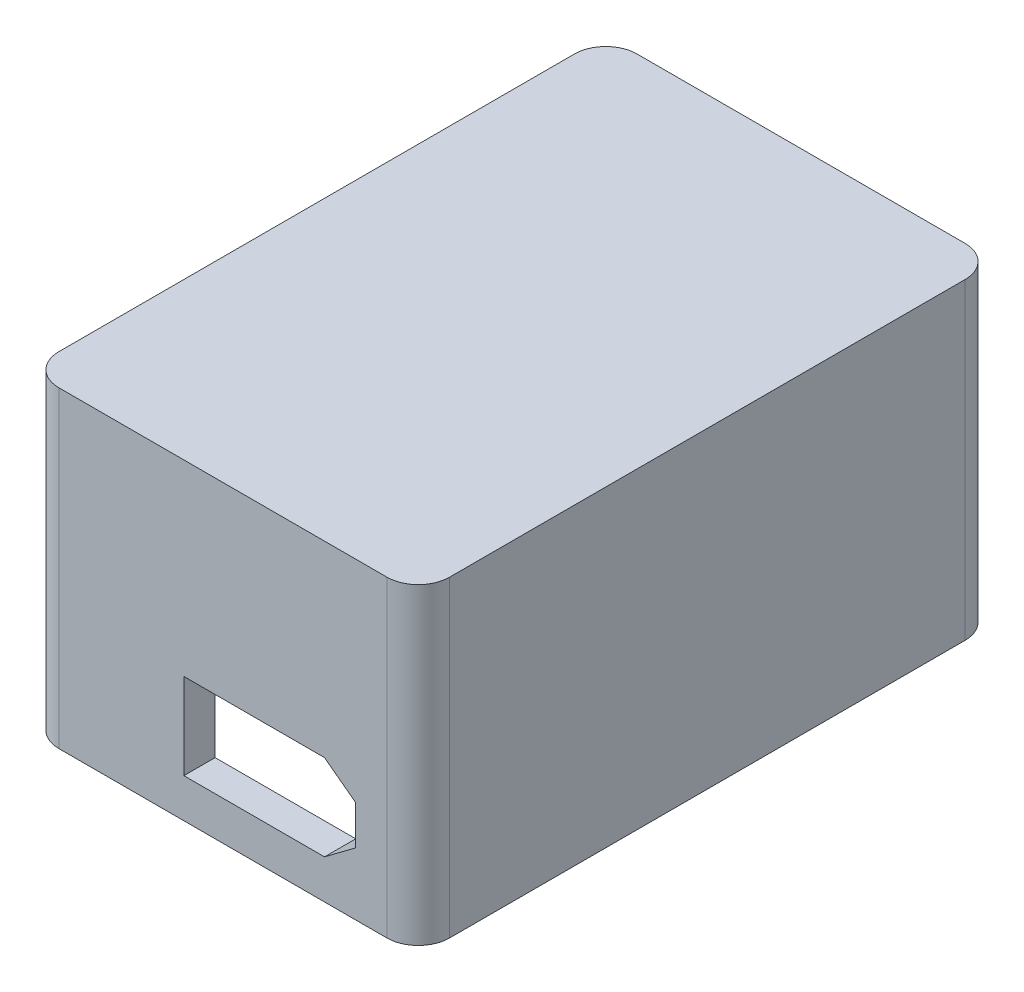
ISO-10303-21;
HEADER;
FILE_DESCRIPTION(('STEP AP214'),'2;1');
FILE_NAME('part.step','',(''),(''),'','','');
FILE_SCHEMA(('AUTOMOTIVE_DESIGN { 1 0 10303 214 1 1 1 1 }'));
ENDSEC;
DATA;
#1=APPLICATION_CONTEXT('core data for automotive mechanical design processes');
#2=APPLICATION_PROTOCOL_DEFINITION('international standard','automotive_design',2000,#1);
#3=PRODUCT_CONTEXT('',#1,'mechanical');
#4=PRODUCT('Part','Part','',(#3));
#5=PRODUCT_RELATED_PRODUCT_CATEGORY('part','',(#4));
#6=PRODUCT_DEFINITION_FORMATION('','',#4);
#7=PRODUCT_DEFINITION_CONTEXT('part definition',#1,'design');
#8=PRODUCT_DEFINITION('design','',#6,#7);
#9=PRODUCT_DEFINITION_SHAPE('','',#8);
#10=(LENGTH_UNIT() NAMED_UNIT(*) SI_UNIT(.MILLI.,.METRE.));
#11=(NAMED_UNIT(*) PLANE_ANGLE_UNIT() SI_UNIT($,.RADIAN.));
#12=(NAMED_UNIT(*) SI_UNIT($,.STERADIAN.) SOLID_ANGLE_UNIT());
#13=UNCERTAINTY_MEASURE_WITH_UNIT(LENGTH_MEASURE(1.E-05),#10,'distance_accuracy_value','');
#14=(GEOMETRIC_REPRESENTATION_CONTEXT(3) GLOBAL_UNCERTAINTY_ASSIGNED_CONTEXT((#13)) GLOBAL_UNIT_ASSIGNED_CONTEXT((#10,
#11,#12)) REPRESENTATION_CONTEXT('',''));
#15=CARTESIAN_POINT('',(0.,0.,0.));
#16=DIRECTION('',(0.,0.,1.));
#17=DIRECTION('',(1.,0.,0.));
#18=AXIS2_PLACEMENT_3D('',#15,#16,#17);
#19=CARTESIAN_POINT('',(12.5,20.,-18.5));
#20=DIRECTION('',(-1.,0.,0.));
#21=DIRECTION('',(0.,0.,1.));
#22=AXIS2_PLACEMENT_3D('',#19,#20,#21);
#23=PLANE('',#22);
#24=DIRECTION('',(0.,0.,-1.));
#25=VECTOR('',#24,1.);
#26=CARTESIAN_POINT('',(12.5,20.,-18.5));
#27=LINE('',#26,#25);
#28=CARTESIAN_POINT('',(12.5,20.,16.5));
#29=VERTEX_POINT('',#28);
#30=CARTESIAN_POINT('',(12.5,20.,-16.5));
#31=VERTEX_POINT('',#30);
#32=EDGE_CURVE('E299',#29,#31,#27,.T.);
#33=ORIENTED_EDGE('',*,*,#32,.F.);
#34=DIRECTION('',(0.,-1.,0.));
#35=VECTOR('',#34,1.);
#36=CARTESIAN_POINT('',(12.5,20.,16.5));
#37=LINE('',#36,#35);
#38=CARTESIAN_POINT('',(12.5,0.,16.5));
#39=VERTEX_POINT('',#38);
#40=EDGE_CURVE('E350',#29,#39,#37,.T.);
#41=ORIENTED_EDGE('',*,*,#40,.T.);
#42=DIRECTION('',(0.,0.,-1.));
#43=VECTOR('',#42,1.);
#44=CARTESIAN_POINT('',(12.5,0.,-18.5));
#45=LINE('',#44,#43);
#46=CARTESIAN_POINT('',(12.5,0.,-16.5));
#47=VERTEX_POINT('',#46);
#48=EDGE_CURVE('E271',#39,#47,#45,.T.);
#49=ORIENTED_EDGE('',*,*,#48,.T.);
#50=DIRECTION('',(0.,-1.,0.));
#51=VECTOR('',#50,1.);
#52=CARTESIAN_POINT('',(12.5,20.,-16.5));
#53=LINE('',#52,#51);
#54=EDGE_CURVE('E348',#47,#31,#53,.F.);
#55=ORIENTED_EDGE('',*,*,#54,.T.);
#56=EDGE_LOOP('',(#33,#41,#49,#55));
#57=FACE_BOUND('',#56,.T.);
#58=ADVANCED_FACE('F35',(#57),#23,.F.);
#59=CARTESIAN_POINT('',(-12.5,20.,-18.5));
#60=DIRECTION('',(0.,0.,1.));
#61=DIRECTION('',(1.,0.,0.));
#62=AXIS2_PLACEMENT_3D('',#59,#60,#61);
#63=PLANE('',#62);
#64=DIRECTION('',(-1.,0.,0.));
#65=VECTOR('',#64,1.);
#66=CARTESIAN_POINT('',(0.,9.8,-18.5));
#67=LINE('',#66,#65);
#68=CARTESIAN_POINT('',(3.5,9.8,-18.5));
#69=VERTEX_POINT('',#68);
#70=CARTESIAN_POINT('',(-3.5,9.8,-18.5));
#71=VERTEX_POINT('',#70);
#72=EDGE_CURVE('E185',#69,#71,#67,.T.);
#73=ORIENTED_EDGE('',*,*,#72,.F.);
#74=CARTESIAN_POINT('',(3.5,11.4,-18.5));
#75=DIRECTION('',(0.,0.,-1.));
#76=DIRECTION('',(-1.,0.,0.));
#77=AXIS2_PLACEMENT_3D('',#74,#75,#76);
#78=CIRCLE('',#77,1.6);
#79=CARTESIAN_POINT('',(3.5,13.,-18.5));
#80=VERTEX_POINT('',#79);
#81=EDGE_CURVE('E206',#80,#69,#78,.T.);
#82=ORIENTED_EDGE('',*,*,#81,.F.);
#83=DIRECTION('',(-1.,0.,0.));
#84=VECTOR('',#83,1.);
#85=CARTESIAN_POINT('',(0.,13.,-18.5));
#86=LINE('',#85,#84);
#87=CARTESIAN_POINT('',(-3.5,13.,-18.5));
#88=VERTEX_POINT('',#87);
#89=EDGE_CURVE('E50',#80,#88,#86,.T.);
#90=ORIENTED_EDGE('',*,*,#89,.T.);
#91=CARTESIAN_POINT('',(-3.5,11.4,-18.5));
#92=DIRECTION('',(0.,0.,-1.));
#93=DIRECTION('',(-1.,0.,0.));
#94=AXIS2_PLACEMENT_3D('',#91,#92,#93);
#95=CIRCLE('',#94,1.6);
#96=EDGE_CURVE('E193',#71,#88,#95,.T.);
#97=ORIENTED_EDGE('',*,*,#96,.F.);
#98=EDGE_LOOP('',(#73,#82,#90,#97));
#99=FACE_BOUND('',#98,.T.);
#100=DIRECTION('',(-1.,0.,0.));
#101=VECTOR('',#100,1.);
#102=CARTESIAN_POINT('',(-12.5,0.,-18.5));
#103=LINE('',#102,#101);
#104=CARTESIAN_POINT('',(10.5,0.,-18.5));
#105=VERTEX_POINT('',#104);
#106=CARTESIAN_POINT('',(-10.5,0.,-18.5));
#107=VERTEX_POINT('',#106);
#108=EDGE_CURVE('E315',#105,#107,#103,.T.);
#109=ORIENTED_EDGE('',*,*,#108,.T.);
#110=DIRECTION('',(0.,-1.,0.));
#111=VECTOR('',#110,1.);
#112=CARTESIAN_POINT('',(-10.5,20.,-18.5));
#113=LINE('',#112,#111);
#114=CARTESIAN_POINT('',(-10.5,20.,-18.5));
#115=VERTEX_POINT('',#114);
#116=EDGE_CURVE('E11',#107,#115,#113,.F.);
#117=ORIENTED_EDGE('',*,*,#116,.T.);
#118=DIRECTION('',(-1.,0.,0.));
#119=VECTOR('',#118,1.);
#120=CARTESIAN_POINT('',(-12.5,20.,-18.5));
#121=LINE('',#120,#119);
#122=CARTESIAN_POINT('',(10.5,20.,-18.5));
#123=VERTEX_POINT('',#122);
#124=EDGE_CURVE('E302',#123,#115,#121,.T.);
#125=ORIENTED_EDGE('',*,*,#124,.F.);
#126=DIRECTION('',(0.,-1.,0.));
#127=VECTOR('',#126,1.);
#128=CARTESIAN_POINT('',(10.5,20.,-18.5));
#129=LINE('',#128,#127);
#130=EDGE_CURVE('E43',#123,#105,#129,.T.);
#131=ORIENTED_EDGE('',*,*,#130,.T.);
#132=EDGE_LOOP('',(#109,#117,#125,#131));
#133=FACE_BOUND('',#132,.T.);
#134=ADVANCED_FACE('F203',(#99,#133),#63,.F.);
#135=CARTESIAN_POINT('',(-12.5,20.,-18.5));
#136=DIRECTION('',(1.,0.,0.));
#137=DIRECTION('',(0.,0.,-1.));
#138=AXIS2_PLACEMENT_3D('',#135,#136,#137);
#139=PLANE('',#138);
#140=DIRECTION('',(0.,0.,1.));
#141=VECTOR('',#140,1.);
#142=CARTESIAN_POINT('',(-12.5,0.,-18.5));
#143=LINE('',#142,#141);
#144=CARTESIAN_POINT('',(-12.5,0.,-16.5));
#145=VERTEX_POINT('',#144);
#146=CARTESIAN_POINT('',(-12.5,0.,16.5));
#147=VERTEX_POINT('',#146);
#148=EDGE_CURVE('E318',#145,#147,#143,.T.);
#149=ORIENTED_EDGE('',*,*,#148,.T.);
#150=DIRECTION('',(0.,-1.,0.));
#151=VECTOR('',#150,1.);
#152=CARTESIAN_POINT('',(-12.5,20.,16.5));
#153=LINE('',#152,#151);
#154=CARTESIAN_POINT('',(-12.5,20.,16.5));
#155=VERTEX_POINT('',#154);
#156=EDGE_CURVE('E338',#147,#155,#153,.F.);
#157=ORIENTED_EDGE('',*,*,#156,.T.);
#158=DIRECTION('',(0.,0.,1.));
#159=VECTOR('',#158,1.);
#160=CARTESIAN_POINT('',(-12.5,20.,-18.5));
#161=LINE('',#160,#159);
#162=CARTESIAN_POINT('',(-12.5,20.,-16.5));
#163=VERTEX_POINT('',#162);
#164=EDGE_CURVE('E306',#163,#155,#161,.T.);
#165=ORIENTED_EDGE('',*,*,#164,.F.);
#166=DIRECTION('',(0.,-1.,0.));
#167=VECTOR('',#166,1.);
#168=CARTESIAN_POINT('',(-12.5,20.,-16.5));
#169=LINE('',#168,#167);
#170=EDGE_CURVE('E335',#163,#145,#169,.T.);
#171=ORIENTED_EDGE('',*,*,#170,.T.);
#172=EDGE_LOOP('',(#149,#157,#165,#171));
#173=FACE_BOUND('',#172,.T.);
#174=ADVANCED_FACE('F370',(#173),#139,.F.);
#175=CARTESIAN_POINT('',(-12.5,20.,18.5));
#176=DIRECTION('',(0.,0.,-1.));
#177=DIRECTION('',(-1.,0.,0.));
#178=AXIS2_PLACEMENT_3D('',#175,#176,#177);
#179=PLANE('',#178);
#180=DIRECTION('',(0.8,-0.6,0.));
#181=VECTOR('',#180,1.);
#182=CARTESIAN_POINT('',(6.18,8.24,18.5));
#183=LINE('',#182,#181);
#184=CARTESIAN_POINT('',(6.5,8.,18.5));
#185=VERTEX_POINT('',#184);
#186=CARTESIAN_POINT('',(8.5,6.5,18.5));
#187=VERTEX_POINT('',#186);
#188=EDGE_CURVE('E236',#185,#187,#183,.T.);
#189=ORIENTED_EDGE('',*,*,#188,.T.);
#190=DIRECTION('',(0.,-1.,0.));
#191=VECTOR('',#190,1.);
#192=CARTESIAN_POINT('',(8.5,0.,18.5));
#193=LINE('',#192,#191);
#194=CARTESIAN_POINT('',(8.5,4.,18.5));
#195=VERTEX_POINT('',#194);
#196=EDGE_CURVE('E222',#187,#195,#193,.T.);
#197=ORIENTED_EDGE('',*,*,#196,.T.);
#198=DIRECTION('',(-0.8,-0.6,0.));
#199=VECTOR('',#198,1.);
#200=CARTESIAN_POINT('',(1.14,-1.52,18.5));
#201=LINE('',#200,#199);
#202=CARTESIAN_POINT('',(6.5,2.5,18.5));
#203=VERTEX_POINT('',#202);
#204=EDGE_CURVE('E225',#195,#203,#201,.T.);
#205=ORIENTED_EDGE('',*,*,#204,.T.);
#206=DIRECTION('',(-1.,0.,0.));
#207=VECTOR('',#206,1.);
#208=CARTESIAN_POINT('',(0.,2.5,18.5));
#209=LINE('',#208,#207);
#210=CARTESIAN_POINT('',(-2.5,2.5,18.5));
#211=VERTEX_POINT('',#210);
#212=EDGE_CURVE('E229',#203,#211,#209,.T.);
#213=ORIENTED_EDGE('',*,*,#212,.T.);
#214=DIRECTION('',(0.,-1.,0.));
#215=VECTOR('',#214,1.);
#216=CARTESIAN_POINT('',(-2.5,0.,18.5));
#217=LINE('',#216,#215);
#218=CARTESIAN_POINT('',(-2.5,8.,18.5));
#219=VERTEX_POINT('',#218);
#220=EDGE_CURVE('E232',#219,#211,#217,.T.);
#221=ORIENTED_EDGE('',*,*,#220,.F.);
#222=DIRECTION('',(-1.,0.,0.));
#223=VECTOR('',#222,1.);
#224=CARTESIAN_POINT('',(0.,8.,18.5));
#225=LINE('',#224,#223);
#226=EDGE_CURVE('E234',#185,#219,#225,.T.);
#227=ORIENTED_EDGE('',*,*,#226,.F.);
#228=EDGE_LOOP('',(#189,#197,#205,#213,#221,#227));
#229=FACE_BOUND('',#228,.T.);
#230=DIRECTION('',(1.,0.,0.));
#231=VECTOR('',#230,1.);
#232=CARTESIAN_POINT('',(-12.5,20.,18.5));
#233=LINE('',#232,#231);
#234=CARTESIAN_POINT('',(-10.5,20.,18.5));
#235=VERTEX_POINT('',#234);
#236=CARTESIAN_POINT('',(10.5,20.,18.5));
#237=VERTEX_POINT('',#236);
#238=EDGE_CURVE('E309',#235,#237,#233,.T.);
#239=ORIENTED_EDGE('',*,*,#238,.F.);
#240=DIRECTION('',(0.,-1.,0.));
#241=VECTOR('',#240,1.);
#242=CARTESIAN_POINT('',(-10.5,20.,18.5));
#243=LINE('',#242,#241);
#244=CARTESIAN_POINT('',(-10.5,0.,18.5));
#245=VERTEX_POINT('',#244);
#246=EDGE_CURVE('E324',#235,#245,#243,.T.);
#247=ORIENTED_EDGE('',*,*,#246,.T.);
#248=DIRECTION('',(1.,0.,0.));
#249=VECTOR('',#248,1.);
#250=CARTESIAN_POINT('',(-12.5,0.,18.5));
#251=LINE('',#250,#249);
#252=CARTESIAN_POINT('',(10.5,0.,18.5));
#253=VERTEX_POINT('',#252);
#254=EDGE_CURVE('E303',#245,#253,#251,.T.);
#255=ORIENTED_EDGE('',*,*,#254,.T.);
#256=DIRECTION('',(0.,-1.,0.));
#257=VECTOR('',#256,1.);
#258=CARTESIAN_POINT('',(10.5,20.,18.5));
#259=LINE('',#258,#257);
#260=EDGE_CURVE('E312',#253,#237,#259,.F.);
#261=ORIENTED_EDGE('',*,*,#260,.T.);
#262=EDGE_LOOP('',(#239,#247,#255,#261));
#263=FACE_BOUND('',#262,.T.);
#264=ADVANCED_FACE('F380',(#229,#263),#179,.F.);
#265=CARTESIAN_POINT('',(0.,20.,0.));
#266=DIRECTION('',(0.,1.,0.));
#267=DIRECTION('',(0.,0.,1.));
#268=AXIS2_PLACEMENT_3D('',#265,#266,#267);
#269=PLANE('',#268);
#270=ORIENTED_EDGE('',*,*,#164,.T.);
#271=CARTESIAN_POINT('',(-10.5,20.,16.5));
#272=DIRECTION('',(0.,1.,0.));
#273=DIRECTION('',(0.,0.,1.));
#274=AXIS2_PLACEMENT_3D('',#271,#272,#273);
#275=CIRCLE('',#274,2.);
#276=EDGE_CURVE('E346',#155,#235,#275,.T.);
#277=ORIENTED_EDGE('',*,*,#276,.T.);
#278=ORIENTED_EDGE('',*,*,#238,.T.);
#279=CARTESIAN_POINT('',(10.5,20.,16.5));
#280=DIRECTION('',(0.,1.,0.));
#281=DIRECTION('',(0.,0.,1.));
#282=AXIS2_PLACEMENT_3D('',#279,#280,#281);
#283=CIRCLE('',#282,2.);
#284=EDGE_CURVE('E344',#237,#29,#283,.T.);
#285=ORIENTED_EDGE('',*,*,#284,.T.);
#286=ORIENTED_EDGE('',*,*,#32,.T.);
#287=CARTESIAN_POINT('',(10.5,20.,-16.5));
#288=DIRECTION('',(0.,1.,0.));
#289=DIRECTION('',(0.,0.,1.));
#290=AXIS2_PLACEMENT_3D('',#287,#288,#289);
#291=CIRCLE('',#290,2.);
#292=EDGE_CURVE('E340',#31,#123,#291,.T.);
#293=ORIENTED_EDGE('',*,*,#292,.T.);
#294=ORIENTED_EDGE('',*,*,#124,.T.);
#295=CARTESIAN_POINT('',(-10.5,20.,-16.5));
#296=DIRECTION('',(0.,1.,0.));
#297=DIRECTION('',(0.,0.,1.));
#298=AXIS2_PLACEMENT_3D('',#295,#296,#297);
#299=CIRCLE('',#298,2.);
#300=EDGE_CURVE('E342',#115,#163,#299,.T.);
#301=ORIENTED_EDGE('',*,*,#300,.T.);
#302=EDGE_LOOP('',(#270,#277,#278,#285,#286,#293,#294,#301));
#303=FACE_BOUND('',#302,.T.);
#304=ADVANCED_FACE('F374',(#303),#269,.T.);
#305=CARTESIAN_POINT('',(0.,0.,0.));
#306=DIRECTION('',(0.,1.,0.));
#307=DIRECTION('',(0.,0.,1.));
#308=AXIS2_PLACEMENT_3D('',#305,#306,#307);
#309=PLANE('',#308);
#310=DIRECTION('',(1.,0.,0.));
#311=VECTOR('',#310,1.);
#312=CARTESIAN_POINT('',(-12.5,0.,16.5));
#313=LINE('',#312,#311);
#314=CARTESIAN_POINT('',(-10.5,0.,16.5));
#315=VERTEX_POINT('',#314);
#316=CARTESIAN_POINT('',(10.5,0.,16.5));
#317=VERTEX_POINT('',#316);
#318=EDGE_CURVE('E277',#315,#317,#313,.T.);
#319=ORIENTED_EDGE('',*,*,#318,.T.);
#320=DIRECTION('',(0.,0.,-1.));
#321=VECTOR('',#320,1.);
#322=CARTESIAN_POINT('',(10.5,0.,-18.5));
#323=LINE('',#322,#321);
#324=CARTESIAN_POINT('',(10.5,0.,-16.5));
#325=VERTEX_POINT('',#324);
#326=EDGE_CURVE('E257',#317,#325,#323,.T.);
#327=ORIENTED_EDGE('',*,*,#326,.T.);
#328=DIRECTION('',(-1.,0.,0.));
#329=VECTOR('',#328,1.);
#330=CARTESIAN_POINT('',(-12.5,0.,-16.5));
#331=LINE('',#330,#329);
#332=CARTESIAN_POINT('',(-10.5,0.,-16.5));
#333=VERTEX_POINT('',#332);
#334=EDGE_CURVE('E291',#325,#333,#331,.T.);
#335=ORIENTED_EDGE('',*,*,#334,.T.);
#336=DIRECTION('',(0.,0.,1.));
#337=VECTOR('',#336,1.);
#338=CARTESIAN_POINT('',(-10.5,0.,-18.5));
#339=LINE('',#338,#337);
#340=EDGE_CURVE('E294',#333,#315,#339,.T.);
#341=ORIENTED_EDGE('',*,*,#340,.T.);
#342=EDGE_LOOP('',(#319,#327,#335,#341));
#343=FACE_BOUND('',#342,.T.);
#344=ORIENTED_EDGE('',*,*,#254,.F.);
#345=CARTESIAN_POINT('',(-10.5,0.,16.5));
#346=DIRECTION('',(0.,1.,0.));
#347=DIRECTION('',(0.,0.,1.));
#348=AXIS2_PLACEMENT_3D('',#345,#346,#347);
#349=CIRCLE('',#348,2.);
#350=EDGE_CURVE('E333',#245,#147,#349,.F.);
#351=ORIENTED_EDGE('',*,*,#350,.T.);
#352=ORIENTED_EDGE('',*,*,#148,.F.);
#353=CARTESIAN_POINT('',(-10.5,0.,-16.5));
#354=DIRECTION('',(0.,1.,0.));
#355=DIRECTION('',(0.,0.,1.));
#356=AXIS2_PLACEMENT_3D('',#353,#354,#355);
#357=CIRCLE('',#356,2.);
#358=EDGE_CURVE('E329',#145,#107,#357,.F.);
#359=ORIENTED_EDGE('',*,*,#358,.T.);
#360=ORIENTED_EDGE('',*,*,#108,.F.);
#361=CARTESIAN_POINT('',(10.5,0.,-16.5));
#362=DIRECTION('',(0.,1.,0.));
#363=DIRECTION('',(0.,0.,1.));
#364=AXIS2_PLACEMENT_3D('',#361,#362,#363);
#365=CIRCLE('',#364,2.);
#366=EDGE_CURVE('E327',#105,#47,#365,.F.);
#367=ORIENTED_EDGE('',*,*,#366,.T.);
#368=ORIENTED_EDGE('',*,*,#48,.F.);
#369=CARTESIAN_POINT('',(10.5,0.,16.5));
#370=DIRECTION('',(0.,1.,0.));
#371=DIRECTION('',(0.,0.,1.));
#372=AXIS2_PLACEMENT_3D('',#369,#370,#371);
#373=CIRCLE('',#372,2.);
#374=EDGE_CURVE('E331',#39,#253,#373,.F.);
#375=ORIENTED_EDGE('',*,*,#374,.T.);
#376=EDGE_LOOP('',(#344,#351,#352,#359,#360,#367,#368,#375));
#377=FACE_BOUND('',#376,.T.);
#378=ADVANCED_FACE('F361',(#343,#377),#309,.F.);
#379=CARTESIAN_POINT('',(10.5,20.,-18.5));
#380=DIRECTION('',(-1.,0.,0.));
#381=DIRECTION('',(0.,0.,1.));
#382=AXIS2_PLACEMENT_3D('',#379,#380,#381);
#383=PLANE('',#382);
#384=ORIENTED_EDGE('',*,*,#326,.F.);
#385=DIRECTION('',(0.,-1.,0.));
#386=VECTOR('',#385,1.);
#387=CARTESIAN_POINT('',(10.5,20.,16.5));
#388=LINE('',#387,#386);
#389=CARTESIAN_POINT('',(10.5,18.,16.5));
#390=VERTEX_POINT('',#389);
#391=EDGE_CURVE('E278',#390,#317,#388,.T.);
#392=ORIENTED_EDGE('',*,*,#391,.F.);
#393=DIRECTION('',(0.,0.,-1.));
#394=VECTOR('',#393,1.);
#395=CARTESIAN_POINT('',(10.5,18.,-18.5));
#396=LINE('',#395,#394);
#397=CARTESIAN_POINT('',(10.5,18.,-16.5));
#398=VERTEX_POINT('',#397);
#399=EDGE_CURVE('E273',#390,#398,#396,.T.);
#400=ORIENTED_EDGE('',*,*,#399,.T.);
#401=DIRECTION('',(0.,-1.,0.));
#402=VECTOR('',#401,1.);
#403=CARTESIAN_POINT('',(10.5,20.,-16.5));
#404=LINE('',#403,#402);
#405=EDGE_CURVE('E268',#398,#325,#404,.T.);
#406=ORIENTED_EDGE('',*,*,#405,.T.);
#407=EDGE_LOOP('',(#384,#392,#400,#406));
#408=FACE_BOUND('',#407,.T.);
#409=ADVANCED_FACE('F511',(#408),#383,.T.);
#410=CARTESIAN_POINT('',(-12.5,20.,-16.5));
#411=DIRECTION('',(0.,0.,1.));
#412=DIRECTION('',(1.,0.,0.));
#413=AXIS2_PLACEMENT_3D('',#410,#411,#412);
#414=PLANE('',#413);
#415=CARTESIAN_POINT('',(3.5,11.4,-16.5));
#416=DIRECTION('',(0.,0.,1.));
#417=DIRECTION('',(1.,0.,0.));
#418=AXIS2_PLACEMENT_3D('',#415,#416,#417);
#419=CIRCLE('',#418,1.6);
#420=CARTESIAN_POINT('',(3.5,13.,-16.5));
#421=VERTEX_POINT('',#420);
#422=CARTESIAN_POINT('',(3.5,9.8,-16.5));
#423=VERTEX_POINT('',#422);
#424=EDGE_CURVE('E200',#421,#423,#419,.F.);
#425=ORIENTED_EDGE('',*,*,#424,.T.);
#426=DIRECTION('',(-1.,0.,0.));
#427=VECTOR('',#426,1.);
#428=CARTESIAN_POINT('',(-12.5,9.80000000000001,-16.5));
#429=LINE('',#428,#427);
#430=CARTESIAN_POINT('',(-3.5,9.8,-16.5));
#431=VERTEX_POINT('',#430);
#432=EDGE_CURVE('E219',#423,#431,#429,.T.);
#433=ORIENTED_EDGE('',*,*,#432,.T.);
#434=CARTESIAN_POINT('',(-3.5,11.4,-16.5));
#435=DIRECTION('',(0.,0.,1.));
#436=DIRECTION('',(1.,0.,0.));
#437=AXIS2_PLACEMENT_3D('',#434,#435,#436);
#438=CIRCLE('',#437,1.6);
#439=CARTESIAN_POINT('',(-3.5,13.,-16.5));
#440=VERTEX_POINT('',#439);
#441=EDGE_CURVE('E199',#431,#440,#438,.F.);
#442=ORIENTED_EDGE('',*,*,#441,.T.);
#443=DIRECTION('',(-1.,0.,0.));
#444=VECTOR('',#443,1.);
#445=CARTESIAN_POINT('',(-12.5,13.,-16.5));
#446=LINE('',#445,#444);
#447=EDGE_CURVE('E216',#421,#440,#446,.T.);
#448=ORIENTED_EDGE('',*,*,#447,.F.);
#449=EDGE_LOOP('',(#425,#433,#442,#448));
#450=FACE_BOUND('',#449,.T.);
#451=ORIENTED_EDGE('',*,*,#334,.F.);
#452=ORIENTED_EDGE('',*,*,#405,.F.);
#453=DIRECTION('',(-1.,0.,0.));
#454=VECTOR('',#453,1.);
#455=CARTESIAN_POINT('',(-12.5,18.,-16.5));
#456=LINE('',#455,#454);
#457=CARTESIAN_POINT('',(-10.5,18.,-16.5));
#458=VERTEX_POINT('',#457);
#459=EDGE_CURVE('E276',#398,#458,#456,.T.);
#460=ORIENTED_EDGE('',*,*,#459,.T.);
#461=DIRECTION('',(0.,-1.,0.));
#462=VECTOR('',#461,1.);
#463=CARTESIAN_POINT('',(-10.5,20.,-16.5));
#464=LINE('',#463,#462);
#465=EDGE_CURVE('E272',#458,#333,#464,.T.);
#466=ORIENTED_EDGE('',*,*,#465,.T.);
#467=EDGE_LOOP('',(#451,#452,#460,#466));
#468=FACE_BOUND('',#467,.T.);
#469=ADVANCED_FACE('F505',(#450,#468),#414,.T.);
#470=CARTESIAN_POINT('',(-10.5,20.,-18.5));
#471=DIRECTION('',(1.,0.,0.));
#472=DIRECTION('',(0.,0.,-1.));
#473=AXIS2_PLACEMENT_3D('',#470,#471,#472);
#474=PLANE('',#473);
#475=ORIENTED_EDGE('',*,*,#340,.F.);
#476=ORIENTED_EDGE('',*,*,#465,.F.);
#477=DIRECTION('',(0.,0.,1.));
#478=VECTOR('',#477,1.);
#479=CARTESIAN_POINT('',(-10.5,18.,-18.5));
#480=LINE('',#479,#478);
#481=CARTESIAN_POINT('',(-10.5,18.,16.5));
#482=VERTEX_POINT('',#481);
#483=EDGE_CURVE('E285',#458,#482,#480,.T.);
#484=ORIENTED_EDGE('',*,*,#483,.T.);
#485=DIRECTION('',(0.,-1.,0.));
#486=VECTOR('',#485,1.);
#487=CARTESIAN_POINT('',(-10.5,20.,16.5));
#488=LINE('',#487,#486);
#489=EDGE_CURVE('E280',#482,#315,#488,.T.);
#490=ORIENTED_EDGE('',*,*,#489,.T.);
#491=EDGE_LOOP('',(#475,#476,#484,#490));
#492=FACE_BOUND('',#491,.T.);
#493=ADVANCED_FACE('F510',(#492),#474,.T.);
#494=CARTESIAN_POINT('',(-12.5,20.,16.5));
#495=DIRECTION('',(0.,0.,-1.));
#496=DIRECTION('',(-1.,0.,0.));
#497=AXIS2_PLACEMENT_3D('',#494,#495,#496);
#498=PLANE('',#497);
#499=DIRECTION('',(0.,-1.,0.));
#500=VECTOR('',#499,1.);
#501=CARTESIAN_POINT('',(8.5,0.,16.5));
#502=LINE('',#501,#500);
#503=CARTESIAN_POINT('',(8.5,6.5,16.5));
#504=VERTEX_POINT('',#503);
#505=CARTESIAN_POINT('',(8.5,4.,16.5));
#506=VERTEX_POINT('',#505);
#507=EDGE_CURVE('E221',#504,#506,#502,.T.);
#508=ORIENTED_EDGE('',*,*,#507,.F.);
#509=DIRECTION('',(0.8,-0.6,0.));
#510=VECTOR('',#509,1.);
#511=CARTESIAN_POINT('',(6.18,8.24,16.5));
#512=LINE('',#511,#510);
#513=CARTESIAN_POINT('',(6.5,8.,16.5));
#514=VERTEX_POINT('',#513);
#515=EDGE_CURVE('E226',#514,#504,#512,.T.);
#516=ORIENTED_EDGE('',*,*,#515,.F.);
#517=DIRECTION('',(-1.,0.,0.));
#518=VECTOR('',#517,1.);
#519=CARTESIAN_POINT('',(0.,8.,16.5));
#520=LINE('',#519,#518);
#521=CARTESIAN_POINT('',(-2.5,8.,16.5));
#522=VERTEX_POINT('',#521);
#523=EDGE_CURVE('E250',#514,#522,#520,.T.);
#524=ORIENTED_EDGE('',*,*,#523,.T.);
#525=DIRECTION('',(0.,-1.,0.));
#526=VECTOR('',#525,1.);
#527=CARTESIAN_POINT('',(-2.5,0.,16.5));
#528=LINE('',#527,#526);
#529=CARTESIAN_POINT('',(-2.5,2.5,16.5));
#530=VERTEX_POINT('',#529);
#531=EDGE_CURVE('E247',#522,#530,#528,.T.);
#532=ORIENTED_EDGE('',*,*,#531,.T.);
#533=DIRECTION('',(-1.,0.,0.));
#534=VECTOR('',#533,1.);
#535=CARTESIAN_POINT('',(0.,2.5,16.5));
#536=LINE('',#535,#534);
#537=CARTESIAN_POINT('',(6.5,2.5,16.5));
#538=VERTEX_POINT('',#537);
#539=EDGE_CURVE('E244',#538,#530,#536,.T.);
#540=ORIENTED_EDGE('',*,*,#539,.F.);
#541=DIRECTION('',(-0.8,-0.6,0.));
#542=VECTOR('',#541,1.);
#543=CARTESIAN_POINT('',(1.14,-1.52,16.5));
#544=LINE('',#543,#542);
#545=EDGE_CURVE('E241',#506,#538,#544,.T.);
#546=ORIENTED_EDGE('',*,*,#545,.F.);
#547=EDGE_LOOP('',(#508,#516,#524,#532,#540,#546));
#548=FACE_BOUND('',#547,.T.);
#549=ORIENTED_EDGE('',*,*,#318,.F.);
#550=ORIENTED_EDGE('',*,*,#489,.F.);
#551=DIRECTION('',(1.,0.,0.));
#552=VECTOR('',#551,1.);
#553=CARTESIAN_POINT('',(-12.5,18.,16.5));
#554=LINE('',#553,#552);
#555=EDGE_CURVE('E281',#482,#390,#554,.T.);
#556=ORIENTED_EDGE('',*,*,#555,.T.);
#557=ORIENTED_EDGE('',*,*,#391,.T.);
#558=EDGE_LOOP('',(#549,#550,#556,#557));
#559=FACE_BOUND('',#558,.T.);
#560=ADVANCED_FACE('F521',(#548,#559),#498,.T.);
#561=CARTESIAN_POINT('',(0.,18.,0.));
#562=DIRECTION('',(0.,1.,0.));
#563=DIRECTION('',(0.,0.,1.));
#564=AXIS2_PLACEMENT_3D('',#561,#562,#563);
#565=PLANE('',#564);
#566=ORIENTED_EDGE('',*,*,#399,.F.);
#567=ORIENTED_EDGE('',*,*,#555,.F.);
#568=ORIENTED_EDGE('',*,*,#483,.F.);
#569=ORIENTED_EDGE('',*,*,#459,.F.);
#570=EDGE_LOOP('',(#566,#567,#568,#569));
#571=FACE_BOUND('',#570,.T.);
#572=ADVANCED_FACE('F408',(#571),#565,.F.);
#573=CARTESIAN_POINT('',(-10.5,20.,16.5));
#574=DIRECTION('',(0.,-1.,0.));
#575=DIRECTION('',(0.,0.,-1.));
#576=AXIS2_PLACEMENT_3D('',#573,#574,#575);
#577=CYLINDRICAL_SURFACE('',#576,2.);
#578=ORIENTED_EDGE('',*,*,#276,.F.);
#579=ORIENTED_EDGE('',*,*,#156,.F.);
#580=ORIENTED_EDGE('',*,*,#350,.F.);
#581=ORIENTED_EDGE('',*,*,#246,.F.);
#582=EDGE_LOOP('',(#578,#579,#580,#581));
#583=FACE_BOUND('',#582,.T.);
#584=ADVANCED_FACE('F378',(#583),#577,.T.);
#585=CARTESIAN_POINT('',(10.5,20.,16.5));
#586=DIRECTION('',(0.,-1.,0.));
#587=DIRECTION('',(0.,0.,-1.));
#588=AXIS2_PLACEMENT_3D('',#585,#586,#587);
#589=CYLINDRICAL_SURFACE('',#588,2.);
#590=ORIENTED_EDGE('',*,*,#284,.F.);
#591=ORIENTED_EDGE('',*,*,#260,.F.);
#592=ORIENTED_EDGE('',*,*,#374,.F.);
#593=ORIENTED_EDGE('',*,*,#40,.F.);
#594=EDGE_LOOP('',(#590,#591,#592,#593));
#595=FACE_BOUND('',#594,.T.);
#596=ADVANCED_FACE('F385',(#595),#589,.T.);
#597=CARTESIAN_POINT('',(-10.5,20.,-16.5));
#598=DIRECTION('',(0.,-1.,0.));
#599=DIRECTION('',(0.,0.,-1.));
#600=AXIS2_PLACEMENT_3D('',#597,#598,#599);
#601=CYLINDRICAL_SURFACE('',#600,2.);
#602=ORIENTED_EDGE('',*,*,#300,.F.);
#603=ORIENTED_EDGE('',*,*,#116,.F.);
#604=ORIENTED_EDGE('',*,*,#358,.F.);
#605=ORIENTED_EDGE('',*,*,#170,.F.);
#606=EDGE_LOOP('',(#602,#603,#604,#605));
#607=FACE_BOUND('',#606,.T.);
#608=ADVANCED_FACE('F367',(#607),#601,.T.);
#609=CARTESIAN_POINT('',(10.5,20.,-16.5));
#610=DIRECTION('',(0.,-1.,0.));
#611=DIRECTION('',(0.,0.,-1.));
#612=AXIS2_PLACEMENT_3D('',#609,#610,#611);
#613=CYLINDRICAL_SURFACE('',#612,2.);
#614=ORIENTED_EDGE('',*,*,#292,.F.);
#615=ORIENTED_EDGE('',*,*,#54,.F.);
#616=ORIENTED_EDGE('',*,*,#366,.F.);
#617=ORIENTED_EDGE('',*,*,#130,.F.);
#618=EDGE_LOOP('',(#614,#615,#616,#617));
#619=FACE_BOUND('',#618,.T.);
#620=ADVANCED_FACE('F37',(#619),#613,.T.);
#621=CARTESIAN_POINT('',(8.5,0.,18.5));
#622=DIRECTION('',(1.,0.,0.));
#623=DIRECTION('',(0.,1.,0.));
#624=AXIS2_PLACEMENT_3D('',#621,#622,#623);
#625=PLANE('',#624);
#626=ORIENTED_EDGE('',*,*,#507,.T.);
#627=DIRECTION('',(0.,0.,-1.));
#628=VECTOR('',#627,1.);
#629=CARTESIAN_POINT('',(8.5,4.,18.5));
#630=LINE('',#629,#628);
#631=EDGE_CURVE('E239',#195,#506,#630,.T.);
#632=ORIENTED_EDGE('',*,*,#631,.F.);
#633=ORIENTED_EDGE('',*,*,#196,.F.);
#634=DIRECTION('',(0.,0.,-1.));
#635=VECTOR('',#634,1.);
#636=CARTESIAN_POINT('',(8.5,6.5,18.5));
#637=LINE('',#636,#635);
#638=EDGE_CURVE('E255',#187,#504,#637,.T.);
#639=ORIENTED_EDGE('',*,*,#638,.T.);
#640=EDGE_LOOP('',(#626,#632,#633,#639));
#641=FACE_BOUND('',#640,.T.);
#642=ADVANCED_FACE('F390',(#641),#625,.F.);
#643=CARTESIAN_POINT('',(6.18,8.24,18.5));
#644=DIRECTION('',(0.6,0.8,0.));
#645=DIRECTION('',(-0.8,0.6,0.));
#646=AXIS2_PLACEMENT_3D('',#643,#644,#645);
#647=PLANE('',#646);
#648=ORIENTED_EDGE('',*,*,#515,.T.);
#649=ORIENTED_EDGE('',*,*,#638,.F.);
#650=ORIENTED_EDGE('',*,*,#188,.F.);
#651=DIRECTION('',(0.,0.,-1.));
#652=VECTOR('',#651,1.);
#653=CARTESIAN_POINT('',(6.5,8.,18.5));
#654=LINE('',#653,#652);
#655=EDGE_CURVE('E258',#185,#514,#654,.T.);
#656=ORIENTED_EDGE('',*,*,#655,.T.);
#657=EDGE_LOOP('',(#648,#649,#650,#656));
#658=FACE_BOUND('',#657,.T.);
#659=ADVANCED_FACE('F395',(#658),#647,.F.);
#660=CARTESIAN_POINT('',(0.,8.,18.5));
#661=DIRECTION('',(0.,-1.,0.));
#662=DIRECTION('',(0.,0.,-1.));
#663=AXIS2_PLACEMENT_3D('',#660,#661,#662);
#664=PLANE('',#663);
#665=ORIENTED_EDGE('',*,*,#523,.F.);
#666=ORIENTED_EDGE('',*,*,#655,.F.);
#667=ORIENTED_EDGE('',*,*,#226,.T.);
#668=DIRECTION('',(0.,0.,-1.));
#669=VECTOR('',#668,1.);
#670=CARTESIAN_POINT('',(-2.5,8.,18.5));
#671=LINE('',#670,#669);
#672=EDGE_CURVE('E260',#219,#522,#671,.T.);
#673=ORIENTED_EDGE('',*,*,#672,.T.);
#674=EDGE_LOOP('',(#665,#666,#667,#673));
#675=FACE_BOUND('',#674,.T.);
#676=ADVANCED_FACE('F451',(#675),#664,.T.);
#677=CARTESIAN_POINT('',(-2.5,0.,18.5));
#678=DIRECTION('',(1.,0.,0.));
#679=DIRECTION('',(0.,0.,-1.));
#680=AXIS2_PLACEMENT_3D('',#677,#678,#679);
#681=PLANE('',#680);
#682=ORIENTED_EDGE('',*,*,#531,.F.);
#683=ORIENTED_EDGE('',*,*,#672,.F.);
#684=ORIENTED_EDGE('',*,*,#220,.T.);
#685=DIRECTION('',(0.,0.,-1.));
#686=VECTOR('',#685,1.);
#687=CARTESIAN_POINT('',(-2.5,2.5,18.5));
#688=LINE('',#687,#686);
#689=EDGE_CURVE('E262',#211,#530,#688,.T.);
#690=ORIENTED_EDGE('',*,*,#689,.T.);
#691=EDGE_LOOP('',(#682,#683,#684,#690));
#692=FACE_BOUND('',#691,.T.);
#693=ADVANCED_FACE('F461',(#692),#681,.T.);
#694=CARTESIAN_POINT('',(0.,2.5,18.5));
#695=DIRECTION('',(0.,-1.,0.));
#696=DIRECTION('',(0.,0.,-1.));
#697=AXIS2_PLACEMENT_3D('',#694,#695,#696);
#698=PLANE('',#697);
#699=ORIENTED_EDGE('',*,*,#539,.T.);
#700=ORIENTED_EDGE('',*,*,#689,.F.);
#701=ORIENTED_EDGE('',*,*,#212,.F.);
#702=DIRECTION('',(0.,0.,-1.));
#703=VECTOR('',#702,1.);
#704=CARTESIAN_POINT('',(6.5,2.5,18.5));
#705=LINE('',#704,#703);
#706=EDGE_CURVE('E264',#203,#538,#705,.T.);
#707=ORIENTED_EDGE('',*,*,#706,.T.);
#708=EDGE_LOOP('',(#699,#700,#701,#707));
#709=FACE_BOUND('',#708,.T.);
#710=ADVANCED_FACE('F471',(#709),#698,.F.);
#711=CARTESIAN_POINT('',(1.14,-1.52,18.5));
#712=DIRECTION('',(0.6,-0.8,0.));
#713=DIRECTION('',(0.8,0.6,0.));
#714=AXIS2_PLACEMENT_3D('',#711,#712,#713);
#715=PLANE('',#714);
#716=ORIENTED_EDGE('',*,*,#545,.T.);
#717=ORIENTED_EDGE('',*,*,#706,.F.);
#718=ORIENTED_EDGE('',*,*,#204,.F.);
#719=ORIENTED_EDGE('',*,*,#631,.T.);
#720=EDGE_LOOP('',(#716,#717,#718,#719));
#721=FACE_BOUND('',#720,.T.);
#722=ADVANCED_FACE('F481',(#721),#715,.F.);
#723=CARTESIAN_POINT('',(0.,9.8,-18.5));
#724=DIRECTION('',(0.,1.,0.));
#725=DIRECTION('',(-1.,0.,0.));
#726=AXIS2_PLACEMENT_3D('',#723,#724,#725);
#727=PLANE('',#726);
#728=DIRECTION('',(0.,0.,1.));
#729=VECTOR('',#728,1.);
#730=CARTESIAN_POINT('',(3.5,9.8,-18.5));
#731=LINE('',#730,#729);
#732=EDGE_CURVE('E58',#69,#423,#731,.T.);
#733=ORIENTED_EDGE('',*,*,#732,.F.);
#734=ORIENTED_EDGE('',*,*,#72,.T.);
#735=DIRECTION('',(0.,0.,1.));
#736=VECTOR('',#735,1.);
#737=CARTESIAN_POINT('',(-3.5,9.8,-18.5));
#738=LINE('',#737,#736);
#739=EDGE_CURVE('E188',#71,#431,#738,.T.);
#740=ORIENTED_EDGE('',*,*,#739,.T.);
#741=ORIENTED_EDGE('',*,*,#432,.F.);
#742=EDGE_LOOP('',(#733,#734,#740,#741));
#743=FACE_BOUND('',#742,.T.);
#744=ADVANCED_FACE('F187',(#743),#727,.T.);
#745=CARTESIAN_POINT('',(-3.5,11.4,-18.5));
#746=DIRECTION('',(0.,0.,1.));
#747=DIRECTION('',(1.,0.,0.));
#748=AXIS2_PLACEMENT_3D('',#745,#746,#747);
#749=CYLINDRICAL_SURFACE('',#748,1.6);
#750=ORIENTED_EDGE('',*,*,#739,.F.);
#751=ORIENTED_EDGE('',*,*,#96,.T.);
#752=DIRECTION('',(0.,0.,1.));
#753=VECTOR('',#752,1.);
#754=CARTESIAN_POINT('',(-3.5,13.,-18.5));
#755=LINE('',#754,#753);
#756=EDGE_CURVE('E201',#88,#440,#755,.T.);
#757=ORIENTED_EDGE('',*,*,#756,.T.);
#758=ORIENTED_EDGE('',*,*,#441,.F.);
#759=EDGE_LOOP('',(#750,#751,#757,#758));
#760=FACE_BOUND('',#759,.T.);
#761=ADVANCED_FACE('F196',(#760),#749,.F.);
#762=CARTESIAN_POINT('',(0.,13.,-18.5));
#763=DIRECTION('',(0.,1.,0.));
#764=DIRECTION('',(-1.,0.,0.));
#765=AXIS2_PLACEMENT_3D('',#762,#763,#764);
#766=PLANE('',#765);
#767=ORIENTED_EDGE('',*,*,#447,.T.);
#768=ORIENTED_EDGE('',*,*,#756,.F.);
#769=ORIENTED_EDGE('',*,*,#89,.F.);
#770=DIRECTION('',(0.,0.,1.));
#771=VECTOR('',#770,1.);
#772=CARTESIAN_POINT('',(3.5,13.,-18.5));
#773=LINE('',#772,#771);
#774=EDGE_CURVE('E211',#80,#421,#773,.T.);
#775=ORIENTED_EDGE('',*,*,#774,.T.);
#776=EDGE_LOOP('',(#767,#768,#769,#775));
#777=FACE_BOUND('',#776,.T.);
#778=ADVANCED_FACE('F542',(#777),#766,.F.);
#779=CARTESIAN_POINT('',(3.5,11.4,-18.5));
#780=DIRECTION('',(0.,0.,1.));
#781=DIRECTION('',(1.,0.,0.));
#782=AXIS2_PLACEMENT_3D('',#779,#780,#781);
#783=CYLINDRICAL_SURFACE('',#782,1.6);
#784=ORIENTED_EDGE('',*,*,#774,.F.);
#785=ORIENTED_EDGE('',*,*,#81,.T.);
#786=ORIENTED_EDGE('',*,*,#732,.T.);
#787=ORIENTED_EDGE('',*,*,#424,.F.);
#788=EDGE_LOOP('',(#784,#785,#786,#787));
#789=FACE_BOUND('',#788,.T.);
#790=ADVANCED_FACE('F551',(#789),#783,.F.);
#791=CLOSED_SHELL('',(#58,#134,#174,#264,#304,#378,#409,#469,#493,#560,#572,#584,#596,#608,#620,
#642,#659,#676,#693,#710,#722,#744,#761,#778,#790));
#792=MANIFOLD_SOLID_BREP('B2',#791);
#793=ADVANCED_BREP_SHAPE_REPRESENTATION('',(#18,#792),#14);
#794=SHAPE_DEFINITION_REPRESENTATION(#9,#793);
ENDSEC;
END-ISO-10303-21;
